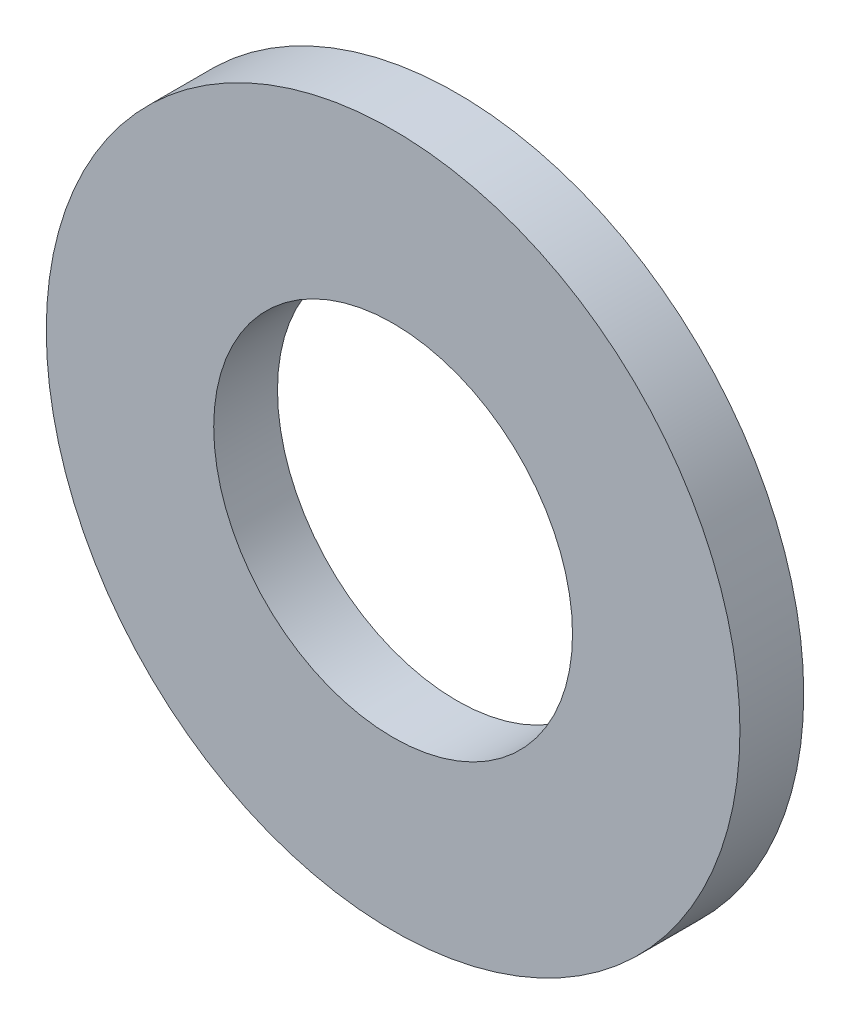
ISO-10303-21;
HEADER;
FILE_DESCRIPTION(('STEP AP214'),'2;1');
FILE_NAME('part.step','',(''),(''),'','','');
FILE_SCHEMA(('AUTOMOTIVE_DESIGN { 1 0 10303 214 1 1 1 1 }'));
ENDSEC;
DATA;
#1=APPLICATION_CONTEXT('core data for automotive mechanical design processes');
#2=APPLICATION_PROTOCOL_DEFINITION('international standard','automotive_design',2000,#1);
#3=PRODUCT_CONTEXT('',#1,'mechanical');
#4=PRODUCT('Part','Part','',(#3));
#5=PRODUCT_RELATED_PRODUCT_CATEGORY('part','',(#4));
#6=PRODUCT_DEFINITION_FORMATION('','',#4);
#7=PRODUCT_DEFINITION_CONTEXT('part definition',#1,'design');
#8=PRODUCT_DEFINITION('design','',#6,#7);
#9=PRODUCT_DEFINITION_SHAPE('','',#8);
#10=(LENGTH_UNIT() NAMED_UNIT(*) SI_UNIT(.MILLI.,.METRE.));
#11=(NAMED_UNIT(*) PLANE_ANGLE_UNIT() SI_UNIT($,.RADIAN.));
#12=(NAMED_UNIT(*) SI_UNIT($,.STERADIAN.) SOLID_ANGLE_UNIT());
#13=UNCERTAINTY_MEASURE_WITH_UNIT(LENGTH_MEASURE(1.E-05),#10,'distance_accuracy_value','');
#14=(GEOMETRIC_REPRESENTATION_CONTEXT(3) GLOBAL_UNCERTAINTY_ASSIGNED_CONTEXT((#13)) GLOBAL_UNIT_ASSIGNED_CONTEXT((#10,
#11,#12)) REPRESENTATION_CONTEXT('',''));
#15=CARTESIAN_POINT('',(0.,0.,0.));
#16=DIRECTION('',(0.,0.,1.));
#17=DIRECTION('',(1.,0.,0.));
#18=AXIS2_PLACEMENT_3D('',#15,#16,#17);
#19=CARTESIAN_POINT('',(0.,0.,0.8));
#20=DIRECTION('',(0.,0.,1.));
#21=DIRECTION('',(1.,0.,0.));
#22=AXIS2_PLACEMENT_3D('',#19,#20,#21);
#23=PLANE('',#22);
#24=CARTESIAN_POINT('',(0.,0.,0.8));
#25=DIRECTION('',(0.,0.,1.));
#26=DIRECTION('',(1.,0.,0.));
#27=AXIS2_PLACEMENT_3D('',#24,#25,#26);
#28=CIRCLE('',#27,4.35);
#29=CARTESIAN_POINT('',(4.35,0.,0.8));
#30=VERTEX_POINT('',#29);
#31=EDGE_CURVE('E10',#30,#30,#28,.T.);
#32=ORIENTED_EDGE('',*,*,#31,.T.);
#33=EDGE_LOOP('',(#32));
#34=FACE_BOUND('',#33,.T.);
#35=CARTESIAN_POINT('',(0.,0.,0.8));
#36=DIRECTION('',(0.,0.,1.));
#37=DIRECTION('',(1.,0.,0.));
#38=AXIS2_PLACEMENT_3D('',#35,#36,#37);
#39=CIRCLE('',#38,2.25);
#40=CARTESIAN_POINT('',(2.25,0.,0.8));
#41=VERTEX_POINT('',#40);
#42=EDGE_CURVE('E46',#41,#41,#39,.T.);
#43=ORIENTED_EDGE('',*,*,#42,.F.);
#44=EDGE_LOOP('',(#43));
#45=FACE_BOUND('',#44,.T.);
#46=ADVANCED_FACE('F35',(#34,#45),#23,.T.);
#47=CARTESIAN_POINT('',(0.,0.,0.));
#48=DIRECTION('',(0.,0.,1.));
#49=DIRECTION('',(1.,0.,0.));
#50=AXIS2_PLACEMENT_3D('',#47,#48,#49);
#51=PLANE('',#50);
#52=CARTESIAN_POINT('',(0.,0.,0.));
#53=DIRECTION('',(0.,0.,1.));
#54=DIRECTION('',(1.,0.,0.));
#55=AXIS2_PLACEMENT_3D('',#52,#53,#54);
#56=CIRCLE('',#55,4.35);
#57=CARTESIAN_POINT('',(4.35,0.,0.));
#58=VERTEX_POINT('',#57);
#59=EDGE_CURVE('E39',#58,#58,#56,.T.);
#60=ORIENTED_EDGE('',*,*,#59,.F.);
#61=EDGE_LOOP('',(#60));
#62=FACE_BOUND('',#61,.T.);
#63=CARTESIAN_POINT('',(0.,0.,0.));
#64=DIRECTION('',(0.,0.,1.));
#65=DIRECTION('',(1.,0.,0.));
#66=AXIS2_PLACEMENT_3D('',#63,#64,#65);
#67=CIRCLE('',#66,2.25);
#68=CARTESIAN_POINT('',(2.25,0.,0.));
#69=VERTEX_POINT('',#68);
#70=EDGE_CURVE('E48',#69,#69,#67,.T.);
#71=ORIENTED_EDGE('',*,*,#70,.T.);
#72=EDGE_LOOP('',(#71));
#73=FACE_BOUND('',#72,.T.);
#74=ADVANCED_FACE('F58',(#62,#73),#51,.F.);
#75=CARTESIAN_POINT('',(0.,0.,0.8));
#76=DIRECTION('',(0.,0.,-1.));
#77=DIRECTION('',(-1.,0.,0.));
#78=AXIS2_PLACEMENT_3D('',#75,#76,#77);
#79=CYLINDRICAL_SURFACE('',#78,4.35);
#80=ORIENTED_EDGE('',*,*,#31,.F.);
#81=EDGE_LOOP('',(#80));
#82=FACE_BOUND('',#81,.T.);
#83=ORIENTED_EDGE('',*,*,#59,.T.);
#84=EDGE_LOOP('',(#83));
#85=FACE_BOUND('',#84,.T.);
#86=ADVANCED_FACE('F37',(#82,#85),#79,.T.);
#87=CARTESIAN_POINT('',(0.,0.,0.8));
#88=DIRECTION('',(0.,0.,-1.));
#89=DIRECTION('',(-1.,0.,0.));
#90=AXIS2_PLACEMENT_3D('',#87,#88,#89);
#91=CYLINDRICAL_SURFACE('',#90,2.25);
#92=ORIENTED_EDGE('',*,*,#42,.T.);
#93=EDGE_LOOP('',(#92));
#94=FACE_BOUND('',#93,.T.);
#95=ORIENTED_EDGE('',*,*,#70,.F.);
#96=EDGE_LOOP('',(#95));
#97=FACE_BOUND('',#96,.T.);
#98=ADVANCED_FACE('F54',(#94,#97),#91,.F.);
#99=CLOSED_SHELL('',(#46,#74,#86,#98));
#100=MANIFOLD_SOLID_BREP('B2',#99);
#101=ADVANCED_BREP_SHAPE_REPRESENTATION('',(#18,#100),#14);
#102=SHAPE_DEFINITION_REPRESENTATION(#9,#101);
ENDSEC;
END-ISO-10303-21;
